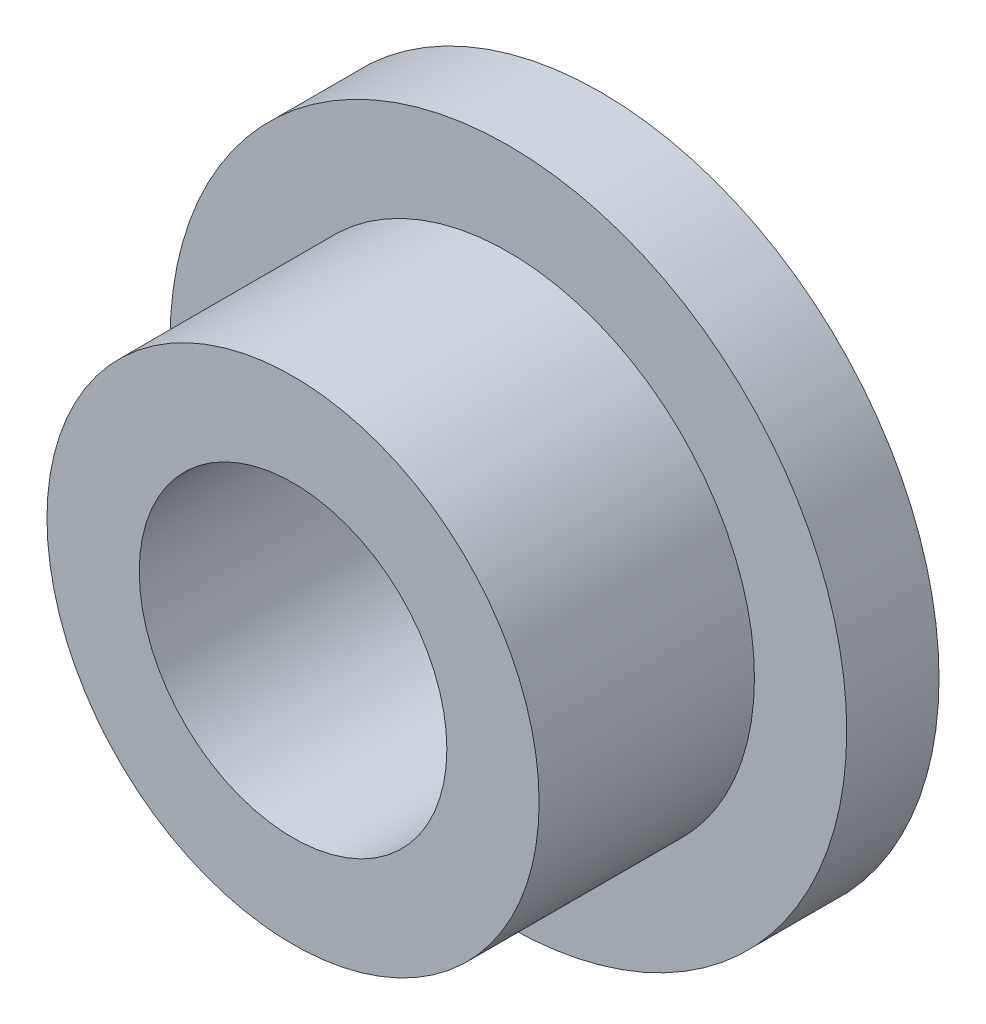
ISO-10303-21;
HEADER;
FILE_DESCRIPTION(('STEP AP214'),'2;1');
FILE_NAME('part.step','',(''),(''),'','','');
FILE_SCHEMA(('AUTOMOTIVE_DESIGN { 1 0 10303 214 1 1 1 1 }'));
ENDSEC;
DATA;
#1=APPLICATION_CONTEXT('core data for automotive mechanical design processes');
#2=APPLICATION_PROTOCOL_DEFINITION('international standard','automotive_design',2000,#1);
#3=PRODUCT_CONTEXT('',#1,'mechanical');
#4=PRODUCT('Part','Part','',(#3));
#5=PRODUCT_RELATED_PRODUCT_CATEGORY('part','',(#4));
#6=PRODUCT_DEFINITION_FORMATION('','',#4);
#7=PRODUCT_DEFINITION_CONTEXT('part definition',#1,'design');
#8=PRODUCT_DEFINITION('design','',#6,#7);
#9=PRODUCT_DEFINITION_SHAPE('','',#8);
#10=(LENGTH_UNIT() NAMED_UNIT(*) SI_UNIT(.MILLI.,.METRE.));
#11=(NAMED_UNIT(*) PLANE_ANGLE_UNIT() SI_UNIT($,.RADIAN.));
#12=(NAMED_UNIT(*) SI_UNIT($,.STERADIAN.) SOLID_ANGLE_UNIT());
#13=UNCERTAINTY_MEASURE_WITH_UNIT(LENGTH_MEASURE(1.E-05),#10,'distance_accuracy_value','');
#14=(GEOMETRIC_REPRESENTATION_CONTEXT(3) GLOBAL_UNCERTAINTY_ASSIGNED_CONTEXT((#13)) GLOBAL_UNIT_ASSIGNED_CONTEXT((#10,
#11,#12)) REPRESENTATION_CONTEXT('',''));
#15=CARTESIAN_POINT('',(0.,0.,0.));
#16=DIRECTION('',(0.,0.,1.));
#17=DIRECTION('',(1.,0.,0.));
#18=AXIS2_PLACEMENT_3D('',#15,#16,#17);
#19=CARTESIAN_POINT('',(0.,0.,3.));
#20=DIRECTION('',(0.,0.,-1.));
#21=DIRECTION('',(-0.999999999999999,0.,0.));
#22=AXIS2_PLACEMENT_3D('',#19,#20,#21);
#23=CYLINDRICAL_SURFACE('',#22,11.);
#24=CARTESIAN_POINT('',(0.,0.,3.));
#25=DIRECTION('',(0.,0.,1.));
#26=DIRECTION('',(0.999999999999999,0.,0.));
#27=AXIS2_PLACEMENT_3D('',#24,#25,#26);
#28=CIRCLE('',#27,11.);
#29=CARTESIAN_POINT('',(11.,0.,3.));
#30=VERTEX_POINT('',#29);
#31=EDGE_CURVE('E41',#30,#30,#28,.T.);
#32=ORIENTED_EDGE('',*,*,#31,.F.);
#33=EDGE_LOOP('',(#32));
#34=FACE_BOUND('',#33,.T.);
#35=CARTESIAN_POINT('',(0.,0.,0.));
#36=DIRECTION('',(0.,0.,1.));
#37=DIRECTION('',(0.999999999999999,0.,0.));
#38=AXIS2_PLACEMENT_3D('',#35,#36,#37);
#39=CIRCLE('',#38,11.);
#40=CARTESIAN_POINT('',(11.,0.,0.));
#41=VERTEX_POINT('',#40);
#42=EDGE_CURVE('E37',#41,#41,#39,.T.);
#43=ORIENTED_EDGE('',*,*,#42,.T.);
#44=EDGE_LOOP('',(#43));
#45=FACE_BOUND('',#44,.T.);
#46=ADVANCED_FACE('F34',(#34,#45),#23,.T.);
#47=CARTESIAN_POINT('',(0.,0.,3.));
#48=DIRECTION('',(0.,0.,1.));
#49=DIRECTION('',(0.999999999999999,0.,0.));
#50=AXIS2_PLACEMENT_3D('',#47,#48,#49);
#51=PLANE('',#50);
#52=CARTESIAN_POINT('',(0.,0.,3.));
#53=DIRECTION('',(0.,0.,1.));
#54=DIRECTION('',(0.999999999999999,0.,0.));
#55=AXIS2_PLACEMENT_3D('',#52,#53,#54);
#56=CIRCLE('',#55,8.);
#57=CARTESIAN_POINT('',(7.99999999999999,0.,3.));
#58=VERTEX_POINT('',#57);
#59=EDGE_CURVE('E10',#58,#58,#56,.T.);
#60=ORIENTED_EDGE('',*,*,#59,.F.);
#61=EDGE_LOOP('',(#60));
#62=FACE_BOUND('',#61,.T.);
#63=ORIENTED_EDGE('',*,*,#31,.T.);
#64=EDGE_LOOP('',(#63));
#65=FACE_BOUND('',#64,.T.);
#66=ADVANCED_FACE('F78',(#62,#65),#51,.T.);
#67=CARTESIAN_POINT('',(0.,0.,0.));
#68=DIRECTION('',(0.,0.,1.));
#69=DIRECTION('',(0.999999999999999,0.,0.));
#70=AXIS2_PLACEMENT_3D('',#67,#68,#69);
#71=PLANE('',#70);
#72=CARTESIAN_POINT('',(0.,0.,0.));
#73=DIRECTION('',(0.,0.,1.));
#74=DIRECTION('',(0.999999999999999,0.,0.));
#75=AXIS2_PLACEMENT_3D('',#72,#73,#74);
#76=CIRCLE('',#75,5.);
#77=CARTESIAN_POINT('',(5.,0.,0.));
#78=VERTEX_POINT('',#77);
#79=EDGE_CURVE('E50',#78,#78,#76,.T.);
#80=ORIENTED_EDGE('',*,*,#79,.T.);
#81=EDGE_LOOP('',(#80));
#82=FACE_BOUND('',#81,.T.);
#83=ORIENTED_EDGE('',*,*,#42,.F.);
#84=EDGE_LOOP('',(#83));
#85=FACE_BOUND('',#84,.T.);
#86=ADVANCED_FACE('F57',(#82,#85),#71,.F.);
#87=CARTESIAN_POINT('',(0.,0.,10.));
#88=DIRECTION('',(0.,0.,-1.));
#89=DIRECTION('',(-0.999999999999999,0.,0.));
#90=AXIS2_PLACEMENT_3D('',#87,#88,#89);
#91=CYLINDRICAL_SURFACE('',#90,8.);
#92=CARTESIAN_POINT('',(0.,0.,10.));
#93=DIRECTION('',(0.,0.,1.));
#94=DIRECTION('',(0.999999999999999,0.,0.));
#95=AXIS2_PLACEMENT_3D('',#92,#93,#94);
#96=CIRCLE('',#95,8.);
#97=CARTESIAN_POINT('',(7.99999999999999,0.,10.));
#98=VERTEX_POINT('',#97);
#99=EDGE_CURVE('E47',#98,#98,#96,.T.);
#100=ORIENTED_EDGE('',*,*,#99,.F.);
#101=EDGE_LOOP('',(#100));
#102=FACE_BOUND('',#101,.T.);
#103=ORIENTED_EDGE('',*,*,#59,.T.);
#104=EDGE_LOOP('',(#103));
#105=FACE_BOUND('',#104,.T.);
#106=ADVANCED_FACE('F69',(#102,#105),#91,.T.);
#107=CARTESIAN_POINT('',(0.,0.,10.));
#108=DIRECTION('',(0.,0.,1.));
#109=DIRECTION('',(0.999999999999999,0.,0.));
#110=AXIS2_PLACEMENT_3D('',#107,#108,#109);
#111=PLANE('',#110);
#112=CARTESIAN_POINT('',(0.,0.,10.));
#113=DIRECTION('',(0.,0.,1.));
#114=DIRECTION('',(0.999999999999999,0.,0.));
#115=AXIS2_PLACEMENT_3D('',#112,#113,#114);
#116=CIRCLE('',#115,5.);
#117=CARTESIAN_POINT('',(5.,0.,10.));
#118=VERTEX_POINT('',#117);
#119=EDGE_CURVE('E51',#118,#118,#116,.T.);
#120=ORIENTED_EDGE('',*,*,#119,.F.);
#121=EDGE_LOOP('',(#120));
#122=FACE_BOUND('',#121,.T.);
#123=ORIENTED_EDGE('',*,*,#99,.T.);
#124=EDGE_LOOP('',(#123));
#125=FACE_BOUND('',#124,.T.);
#126=ADVANCED_FACE('F63',(#122,#125),#111,.T.);
#127=CARTESIAN_POINT('',(0.,0.,0.));
#128=DIRECTION('',(0.,0.,1.));
#129=DIRECTION('',(0.999999999999999,0.,0.));
#130=AXIS2_PLACEMENT_3D('',#127,#128,#129);
#131=CYLINDRICAL_SURFACE('',#130,5.);
#132=ORIENTED_EDGE('',*,*,#79,.F.);
#133=EDGE_LOOP('',(#132));
#134=FACE_BOUND('',#133,.T.);
#135=ORIENTED_EDGE('',*,*,#119,.T.);
#136=EDGE_LOOP('',(#135));
#137=FACE_BOUND('',#136,.T.);
#138=ADVANCED_FACE('F60',(#134,#137),#131,.F.);
#139=CLOSED_SHELL('',(#46,#66,#86,#106,#126,#138));
#140=MANIFOLD_SOLID_BREP('B2',#139);
#141=ADVANCED_BREP_SHAPE_REPRESENTATION('',(#18,#140),#14);
#142=SHAPE_DEFINITION_REPRESENTATION(#9,#141);
ENDSEC;
END-ISO-10303-21;
